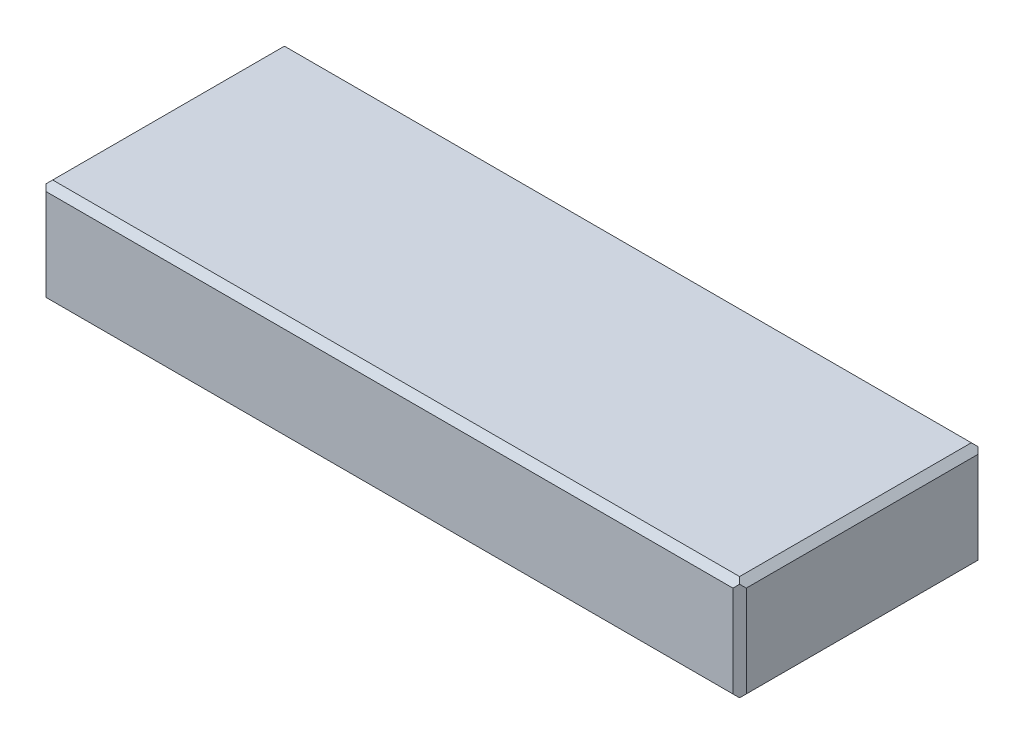
ISO-10303-21;
HEADER;
FILE_DESCRIPTION(('STEP AP214'),'2;1');
FILE_NAME('part.step','',(''),(''),'','','');
FILE_SCHEMA(('AUTOMOTIVE_DESIGN { 1 0 10303 214 1 1 1 1 }'));
ENDSEC;
DATA;
#1=APPLICATION_CONTEXT('core data for automotive mechanical design processes');
#2=APPLICATION_PROTOCOL_DEFINITION('international standard','automotive_design',2000,#1);
#3=PRODUCT_CONTEXT('',#1,'mechanical');
#4=PRODUCT('Part','Part','',(#3));
#5=PRODUCT_RELATED_PRODUCT_CATEGORY('part','',(#4));
#6=PRODUCT_DEFINITION_FORMATION('','',#4);
#7=PRODUCT_DEFINITION_CONTEXT('part definition',#1,'design');
#8=PRODUCT_DEFINITION('design','',#6,#7);
#9=PRODUCT_DEFINITION_SHAPE('','',#8);
#10=(LENGTH_UNIT() NAMED_UNIT(*) SI_UNIT(.MILLI.,.METRE.));
#11=(NAMED_UNIT(*) PLANE_ANGLE_UNIT() SI_UNIT($,.RADIAN.));
#12=(NAMED_UNIT(*) SI_UNIT($,.STERADIAN.) SOLID_ANGLE_UNIT());
#13=UNCERTAINTY_MEASURE_WITH_UNIT(LENGTH_MEASURE(1.E-05),#10,'distance_accuracy_value','');
#14=(GEOMETRIC_REPRESENTATION_CONTEXT(3) GLOBAL_UNCERTAINTY_ASSIGNED_CONTEXT((#13)) GLOBAL_UNIT_ASSIGNED_CONTEXT((#10,
#11,#12)) REPRESENTATION_CONTEXT('',''));
#15=CARTESIAN_POINT('',(0.,0.,0.));
#16=DIRECTION('',(0.,0.,1.));
#17=DIRECTION('',(1.,0.,0.));
#18=AXIS2_PLACEMENT_3D('',#15,#16,#17);
#19=CARTESIAN_POINT('',(-49.1218653149621,29.1510548523207,73.5));
#20=DIRECTION('',(1.,0.,0.));
#21=DIRECTION('',(0.,0.,-1.));
#22=AXIS2_PLACEMENT_3D('',#19,#20,#21);
#23=PLANE('',#22);
#24=DIRECTION('',(0.,0.,1.));
#25=VECTOR('',#24,1.);
#26=CARTESIAN_POINT('',(-49.1218653149621,-0.348945147679344,73.5));
#27=LINE('',#26,#25);
#28=CARTESIAN_POINT('',(-49.1218653149621,-0.348945147679344,1.99999999999996));
#29=VERTEX_POINT('',#28);
#30=CARTESIAN_POINT('',(-49.1218653149621,-0.348945147679344,71.5));
#31=VERTEX_POINT('',#30);
#32=EDGE_CURVE('E171',#29,#31,#27,.T.);
#33=ORIENTED_EDGE('',*,*,#32,.T.);
#34=DIRECTION('',(0.,1.,0.));
#35=VECTOR('',#34,1.);
#36=CARTESIAN_POINT('',(-49.1218653149621,27.1510548523207,71.5));
#37=LINE('',#36,#35);
#38=CARTESIAN_POINT('',(-49.1218653149621,27.1510548523207,71.5));
#39=VERTEX_POINT('',#38);
#40=EDGE_CURVE('E234',#31,#39,#37,.T.);
#41=ORIENTED_EDGE('',*,*,#40,.T.);
#42=DIRECTION('',(0.,0.,-1.));
#43=VECTOR('',#42,1.);
#44=CARTESIAN_POINT('',(-49.1218653149621,27.1510548523207,73.5));
#45=LINE('',#44,#43);
#46=CARTESIAN_POINT('',(-49.1218653149621,27.1510548523207,1.99999999999996));
#47=VERTEX_POINT('',#46);
#48=EDGE_CURVE('E182',#39,#47,#45,.T.);
#49=ORIENTED_EDGE('',*,*,#48,.T.);
#50=DIRECTION('',(0.,-1.,0.));
#51=VECTOR('',#50,1.);
#52=CARTESIAN_POINT('',(-49.1218653149621,29.1510548523207,1.99999999999997));
#53=LINE('',#52,#51);
#54=EDGE_CURVE('E231',#47,#29,#53,.T.);
#55=ORIENTED_EDGE('',*,*,#54,.T.);
#56=EDGE_LOOP('',(#33,#41,#49,#55));
#57=FACE_BOUND('',#56,.T.);
#58=ADVANCED_FACE('F30',(#57),#23,.F.);
#59=CARTESIAN_POINT('',(-49.1218653149621,-2.34894514767932,73.5));
#60=DIRECTION('',(0.,1.,0.));
#61=DIRECTION('',(0.,0.,1.));
#62=AXIS2_PLACEMENT_3D('',#59,#60,#61);
#63=PLANE('',#62);
#64=DIRECTION('',(-1.,0.,0.));
#65=VECTOR('',#64,1.);
#66=CARTESIAN_POINT('',(-49.1218653149621,-2.34894514767932,71.5));
#67=LINE('',#66,#65);
#68=CARTESIAN_POINT('',(158.878134685038,-2.34894514767932,71.5));
#69=VERTEX_POINT('',#68);
#70=CARTESIAN_POINT('',(-47.1218653149621,-2.34894514767932,71.5));
#71=VERTEX_POINT('',#70);
#72=EDGE_CURVE('E160',#69,#71,#67,.T.);
#73=ORIENTED_EDGE('',*,*,#72,.T.);
#74=DIRECTION('',(0.,0.,-1.));
#75=VECTOR('',#74,1.);
#76=CARTESIAN_POINT('',(-47.1218653149621,-2.34894514767932,73.5));
#77=LINE('',#76,#75);
#78=CARTESIAN_POINT('',(-47.1218653149621,-2.34894514767932,1.99999999999997));
#79=VERTEX_POINT('',#78);
#80=EDGE_CURVE('E159',#71,#79,#77,.T.);
#81=ORIENTED_EDGE('',*,*,#80,.T.);
#82=DIRECTION('',(1.,0.,0.));
#83=VECTOR('',#82,1.);
#84=CARTESIAN_POINT('',(-49.1218653149621,-2.34894514767932,1.99999999999997));
#85=LINE('',#84,#83);
#86=CARTESIAN_POINT('',(158.878134685038,-2.34894514767932,1.99999999999997));
#87=VERTEX_POINT('',#86);
#88=EDGE_CURVE('E145',#79,#87,#85,.T.);
#89=ORIENTED_EDGE('',*,*,#88,.T.);
#90=DIRECTION('',(0.,0.,1.));
#91=VECTOR('',#90,1.);
#92=CARTESIAN_POINT('',(158.878134685038,-2.34894514767932,73.5));
#93=LINE('',#92,#91);
#94=EDGE_CURVE('E156',#87,#69,#93,.T.);
#95=ORIENTED_EDGE('',*,*,#94,.T.);
#96=EDGE_LOOP('',(#73,#81,#89,#95));
#97=FACE_BOUND('',#96,.T.);
#98=ADVANCED_FACE('F155',(#97),#63,.F.);
#99=CARTESIAN_POINT('',(160.878134685038,29.1510548523207,73.5));
#100=DIRECTION('',(-1.,0.,0.));
#101=DIRECTION('',(0.,0.,1.));
#102=AXIS2_PLACEMENT_3D('',#99,#100,#101);
#103=PLANE('',#102);
#104=DIRECTION('',(0.,0.,1.));
#105=VECTOR('',#104,1.);
#106=CARTESIAN_POINT('',(160.878134685038,27.1510548523207,73.5));
#107=LINE('',#106,#105);
#108=CARTESIAN_POINT('',(160.878134685038,27.1510548523207,1.99999999999996));
#109=VERTEX_POINT('',#108);
#110=CARTESIAN_POINT('',(160.878134685038,27.1510548523207,71.5));
#111=VERTEX_POINT('',#110);
#112=EDGE_CURVE('E203',#109,#111,#107,.T.);
#113=ORIENTED_EDGE('',*,*,#112,.T.);
#114=DIRECTION('',(0.,-1.,0.));
#115=VECTOR('',#114,1.);
#116=CARTESIAN_POINT('',(160.878134685038,-0.348945147679344,71.5));
#117=LINE('',#116,#115);
#118=CARTESIAN_POINT('',(160.878134685038,-0.348945147679344,71.5));
#119=VERTEX_POINT('',#118);
#120=EDGE_CURVE('E251',#111,#119,#117,.T.);
#121=ORIENTED_EDGE('',*,*,#120,.T.);
#122=DIRECTION('',(0.,0.,-1.));
#123=VECTOR('',#122,1.);
#124=CARTESIAN_POINT('',(160.878134685038,-0.348945147679344,73.5));
#125=LINE('',#124,#123);
#126=CARTESIAN_POINT('',(160.878134685038,-0.348945147679346,1.99999999999996));
#127=VERTEX_POINT('',#126);
#128=EDGE_CURVE('E179',#119,#127,#125,.T.);
#129=ORIENTED_EDGE('',*,*,#128,.T.);
#130=DIRECTION('',(0.,1.,0.));
#131=VECTOR('',#130,1.);
#132=CARTESIAN_POINT('',(160.878134685038,29.1510548523207,1.99999999999997));
#133=LINE('',#132,#131);
#134=EDGE_CURVE('E248',#127,#109,#133,.T.);
#135=ORIENTED_EDGE('',*,*,#134,.T.);
#136=EDGE_LOOP('',(#113,#121,#129,#135));
#137=FACE_BOUND('',#136,.T.);
#138=ADVANCED_FACE('F304',(#137),#103,.F.);
#139=CARTESIAN_POINT('',(-49.1218653149621,29.1510548523207,73.5));
#140=DIRECTION('',(0.,-1.,0.));
#141=DIRECTION('',(0.,0.,-1.));
#142=AXIS2_PLACEMENT_3D('',#139,#140,#141);
#143=PLANE('',#142);
#144=DIRECTION('',(-1.,0.,0.));
#145=VECTOR('',#144,1.);
#146=CARTESIAN_POINT('',(-49.1218653149621,29.1510548523207,1.99999999999997));
#147=LINE('',#146,#145);
#148=CARTESIAN_POINT('',(158.878134685038,29.1510548523207,1.99999999999997));
#149=VERTEX_POINT('',#148);
#150=CARTESIAN_POINT('',(-47.1218653149621,29.1510548523207,1.99999999999997));
#151=VERTEX_POINT('',#150);
#152=EDGE_CURVE('E190',#149,#151,#147,.T.);
#153=ORIENTED_EDGE('',*,*,#152,.T.);
#154=DIRECTION('',(0.,0.,1.));
#155=VECTOR('',#154,1.);
#156=CARTESIAN_POINT('',(-47.1218653149621,29.1510548523207,73.5));
#157=LINE('',#156,#155);
#158=CARTESIAN_POINT('',(-47.1218653149621,29.1510548523207,71.5));
#159=VERTEX_POINT('',#158);
#160=EDGE_CURVE('E197',#151,#159,#157,.T.);
#161=ORIENTED_EDGE('',*,*,#160,.T.);
#162=DIRECTION('',(1.,0.,0.));
#163=VECTOR('',#162,1.);
#164=CARTESIAN_POINT('',(160.878134685038,29.1510548523207,71.5));
#165=LINE('',#164,#163);
#166=CARTESIAN_POINT('',(158.878134685038,29.1510548523207,71.5));
#167=VERTEX_POINT('',#166);
#168=EDGE_CURVE('E194',#159,#167,#165,.T.);
#169=ORIENTED_EDGE('',*,*,#168,.T.);
#170=DIRECTION('',(0.,0.,-1.));
#171=VECTOR('',#170,1.);
#172=CARTESIAN_POINT('',(158.878134685038,29.1510548523207,73.5));
#173=LINE('',#172,#171);
#174=EDGE_CURVE('E192',#167,#149,#173,.T.);
#175=ORIENTED_EDGE('',*,*,#174,.T.);
#176=EDGE_LOOP('',(#153,#161,#169,#175));
#177=FACE_BOUND('',#176,.T.);
#178=ADVANCED_FACE('F295',(#177),#143,.F.);
#179=CARTESIAN_POINT('',(-49.1218653149621,-2.34894514767932,73.5));
#180=DIRECTION('',(0.,0.,1.));
#181=DIRECTION('',(1.,0.,0.));
#182=AXIS2_PLACEMENT_3D('',#179,#180,#181);
#183=PLANE('',#182);
#184=DIRECTION('',(-1.,0.,0.));
#185=VECTOR('',#184,1.);
#186=CARTESIAN_POINT('',(-49.1218653149621,27.1510548523207,73.5));
#187=LINE('',#186,#185);
#188=CARTESIAN_POINT('',(158.878134685038,27.1510548523207,73.5));
#189=VERTEX_POINT('',#188);
#190=CARTESIAN_POINT('',(-47.1218653149621,27.1510548523207,73.5));
#191=VERTEX_POINT('',#190);
#192=EDGE_CURVE('E200',#189,#191,#187,.T.);
#193=ORIENTED_EDGE('',*,*,#192,.T.);
#194=DIRECTION('',(0.,-1.,0.));
#195=VECTOR('',#194,1.);
#196=CARTESIAN_POINT('',(-47.1218653149621,-0.348945147679344,73.5));
#197=LINE('',#196,#195);
#198=CARTESIAN_POINT('',(-47.1218653149621,-0.348945147679339,73.5));
#199=VERTEX_POINT('',#198);
#200=EDGE_CURVE('E220',#191,#199,#197,.T.);
#201=ORIENTED_EDGE('',*,*,#200,.T.);
#202=DIRECTION('',(1.,0.,0.));
#203=VECTOR('',#202,1.);
#204=CARTESIAN_POINT('',(160.878134685038,-0.348945147679344,73.5));
#205=LINE('',#204,#203);
#206=CARTESIAN_POINT('',(158.878134685038,-0.348945147679337,73.5));
#207=VERTEX_POINT('',#206);
#208=EDGE_CURVE('E176',#199,#207,#205,.T.);
#209=ORIENTED_EDGE('',*,*,#208,.T.);
#210=DIRECTION('',(0.,1.,0.));
#211=VECTOR('',#210,1.);
#212=CARTESIAN_POINT('',(158.878134685038,27.1510548523207,73.5));
#213=LINE('',#212,#211);
#214=EDGE_CURVE('E208',#207,#189,#213,.T.);
#215=ORIENTED_EDGE('',*,*,#214,.T.);
#216=EDGE_LOOP('',(#193,#201,#209,#215));
#217=FACE_BOUND('',#216,.T.);
#218=ADVANCED_FACE('F338',(#217),#183,.T.);
#219=CARTESIAN_POINT('',(-49.1218653149621,-2.34894514767932,0.));
#220=DIRECTION('',(0.,0.,1.));
#221=DIRECTION('',(1.,0.,0.));
#222=AXIS2_PLACEMENT_3D('',#219,#220,#221);
#223=PLANE('',#222);
#224=DIRECTION('',(1.,0.,0.));
#225=VECTOR('',#224,1.);
#226=CARTESIAN_POINT('',(-49.1218653149621,27.1510548523207,0.));
#227=LINE('',#226,#225);
#228=CARTESIAN_POINT('',(-47.1218653149621,27.1510548523207,0.));
#229=VERTEX_POINT('',#228);
#230=CARTESIAN_POINT('',(158.878134685038,27.1510548523207,0.));
#231=VERTEX_POINT('',#230);
#232=EDGE_CURVE('E206',#229,#231,#227,.T.);
#233=ORIENTED_EDGE('',*,*,#232,.T.);
#234=DIRECTION('',(0.,-1.,0.));
#235=VECTOR('',#234,1.);
#236=CARTESIAN_POINT('',(158.878134685038,-2.34894514767932,0.));
#237=LINE('',#236,#235);
#238=CARTESIAN_POINT('',(158.878134685038,-0.348945147679344,0.));
#239=VERTEX_POINT('',#238);
#240=EDGE_CURVE('E51',#231,#239,#237,.T.);
#241=ORIENTED_EDGE('',*,*,#240,.T.);
#242=DIRECTION('',(-1.,0.,0.));
#243=VECTOR('',#242,1.);
#244=CARTESIAN_POINT('',(-49.1218653149621,-0.348945147679344,0.));
#245=LINE('',#244,#243);
#246=CARTESIAN_POINT('',(-47.1218653149621,-0.348945147679344,0.));
#247=VERTEX_POINT('',#246);
#248=EDGE_CURVE('E174',#239,#247,#245,.T.);
#249=ORIENTED_EDGE('',*,*,#248,.T.);
#250=DIRECTION('',(0.,1.,0.));
#251=VECTOR('',#250,1.);
#252=CARTESIAN_POINT('',(-47.1218653149621,-2.34894514767932,0.));
#253=LINE('',#252,#251);
#254=EDGE_CURVE('E261',#247,#229,#253,.T.);
#255=ORIENTED_EDGE('',*,*,#254,.T.);
#256=EDGE_LOOP('',(#233,#241,#249,#255));
#257=FACE_BOUND('',#256,.T.);
#258=ADVANCED_FACE('F265',(#257),#223,.F.);
#259=CARTESIAN_POINT('',(160.878134685038,-0.348945147679344,73.5));
#260=DIRECTION('',(-0.707106781186547,0.707106781186547,0.));
#261=DIRECTION('',(-0.707106781186548,-0.707106781186548,0.));
#262=AXIS2_PLACEMENT_3D('',#259,#260,#261);
#263=PLANE('',#262);
#264=ORIENTED_EDGE('',*,*,#128,.F.);
#265=DIRECTION('',(0.577350269189626,0.577350269189626,-0.577350269189626));
#266=VECTOR('',#265,1.);
#267=CARTESIAN_POINT('',(160.211468018371,-1.01561181434602,72.1666666666666));
#268=LINE('',#267,#266);
#269=CARTESIAN_POINT('',(159.878134685038,-1.34894514767936,72.5));
#270=VERTEX_POINT('',#269);
#271=EDGE_CURVE('E255',#119,#270,#268,.F.);
#272=ORIENTED_EDGE('',*,*,#271,.T.);
#273=DIRECTION('',(0.577350269189626,0.577350269189626,0.577350269189626));
#274=VECTOR('',#273,1.);
#275=CARTESIAN_POINT('',(160.878134685038,-0.348945147679344,73.5));
#276=LINE('',#275,#274);
#277=EDGE_CURVE('E151',#69,#270,#276,.T.);
#278=ORIENTED_EDGE('',*,*,#277,.F.);
#279=ORIENTED_EDGE('',*,*,#94,.F.);
#280=DIRECTION('',(0.577350269189626,0.577350269189626,-0.577350269189626));
#281=VECTOR('',#280,1.);
#282=CARTESIAN_POINT('',(136.378134685038,-24.8489451476793,24.5));
#283=LINE('',#282,#281);
#284=CARTESIAN_POINT('',(159.878134685038,-1.34894514767933,0.999999999999985));
#285=VERTEX_POINT('',#284);
#286=EDGE_CURVE('E142',#285,#87,#283,.F.);
#287=ORIENTED_EDGE('',*,*,#286,.F.);
#288=DIRECTION('',(0.577350269189626,0.577350269189626,0.577350269189626));
#289=VECTOR('',#288,1.);
#290=CARTESIAN_POINT('',(184.711468018371,23.484388185654,25.8333333333333));
#291=LINE('',#290,#289);
#292=EDGE_CURVE('E253',#285,#127,#291,.T.);
#293=ORIENTED_EDGE('',*,*,#292,.T.);
#294=EDGE_LOOP('',(#264,#272,#278,#279,#287,#293));
#295=FACE_BOUND('',#294,.T.);
#296=ADVANCED_FACE('F163',(#295),#263,.F.);
#297=CARTESIAN_POINT('',(-49.1218653149621,-0.348945147679344,73.5));
#298=DIRECTION('',(0.,-0.707106781186547,0.707106781186547));
#299=DIRECTION('',(0.,-0.707106781186548,-0.707106781186548));
#300=AXIS2_PLACEMENT_3D('',#297,#298,#299);
#301=PLANE('',#300);
#302=ORIENTED_EDGE('',*,*,#208,.F.);
#303=DIRECTION('',(-0.577350269189626,-0.577350269189626,-0.577350269189626));
#304=VECTOR('',#303,1.);
#305=CARTESIAN_POINT('',(-47.7885319816288,-1.015611814346,72.8333333333333));
#306=LINE('',#305,#304);
#307=CARTESIAN_POINT('',(-48.1218653149621,-1.34894514767933,72.5));
#308=VERTEX_POINT('',#307);
#309=EDGE_CURVE('E225',#199,#308,#306,.T.);
#310=ORIENTED_EDGE('',*,*,#309,.T.);
#311=DIRECTION('',(-0.577350269189626,0.577350269189626,0.577350269189626));
#312=VECTOR('',#311,1.);
#313=CARTESIAN_POINT('',(-49.1218653149621,-0.348945147679344,73.5));
#314=LINE('',#313,#312);
#315=EDGE_CURVE('E152',#71,#308,#314,.T.);
#316=ORIENTED_EDGE('',*,*,#315,.F.);
#317=ORIENTED_EDGE('',*,*,#72,.F.);
#318=ORIENTED_EDGE('',*,*,#277,.T.);
#319=DIRECTION('',(-0.577350269189626,0.577350269189626,0.577350269189626));
#320=VECTOR('',#319,1.);
#321=CARTESIAN_POINT('',(89.5448013517045,68.984388185654,142.833333333333));
#322=LINE('',#321,#320);
#323=EDGE_CURVE('E223',#270,#207,#322,.T.);
#324=ORIENTED_EDGE('',*,*,#323,.T.);
#325=EDGE_LOOP('',(#302,#310,#316,#317,#318,#324));
#326=FACE_BOUND('',#325,.T.);
#327=ADVANCED_FACE('F314',(#326),#301,.T.);
#328=CARTESIAN_POINT('',(-49.1218653149621,-2.34894514767932,1.99999999999997));
#329=DIRECTION('',(0.,0.707106781186547,0.707106781186547));
#330=DIRECTION('',(0.,-0.707106781186548,0.707106781186548));
#331=AXIS2_PLACEMENT_3D('',#328,#329,#330);
#332=PLANE('',#331);
#333=ORIENTED_EDGE('',*,*,#248,.F.);
#334=DIRECTION('',(0.577350269189626,-0.577350269189626,0.577350269189626));
#335=VECTOR('',#334,1.);
#336=CARTESIAN_POINT('',(90.8781346850379,67.6510548523207,-68.));
#337=LINE('',#336,#335);
#338=EDGE_CURVE('E11',#239,#285,#337,.T.);
#339=ORIENTED_EDGE('',*,*,#338,.T.);
#340=ORIENTED_EDGE('',*,*,#286,.T.);
#341=ORIENTED_EDGE('',*,*,#88,.F.);
#342=DIRECTION('',(-0.577350269189626,0.577350269189626,-0.577350269189626));
#343=VECTOR('',#342,1.);
#344=CARTESIAN_POINT('',(-47.7885319816288,-1.68227848101266,1.33333333333332));
#345=LINE('',#344,#343);
#346=CARTESIAN_POINT('',(-48.1218653149621,-1.34894514767933,0.999999999999986));
#347=VERTEX_POINT('',#346);
#348=EDGE_CURVE('E183',#347,#79,#345,.F.);
#349=ORIENTED_EDGE('',*,*,#348,.F.);
#350=DIRECTION('',(0.577350269189626,0.577350269189626,-0.577350269189626));
#351=VECTOR('',#350,1.);
#352=CARTESIAN_POINT('',(-49.1218653149621,-2.34894514767932,1.99999999999997));
#353=LINE('',#352,#351);
#354=EDGE_CURVE('E38',#347,#247,#353,.T.);
#355=ORIENTED_EDGE('',*,*,#354,.T.);
#356=EDGE_LOOP('',(#333,#339,#340,#341,#349,#355));
#357=FACE_BOUND('',#356,.T.);
#358=ADVANCED_FACE('F144',(#357),#332,.F.);
#359=CARTESIAN_POINT('',(-47.1218653149621,-2.34894514767932,73.5));
#360=DIRECTION('',(0.707106781186547,0.707106781186547,0.));
#361=DIRECTION('',(-0.707106781186548,0.707106781186548,0.));
#362=AXIS2_PLACEMENT_3D('',#359,#360,#361);
#363=PLANE('',#362);
#364=ORIENTED_EDGE('',*,*,#315,.T.);
#365=DIRECTION('',(0.577350269189626,-0.577350269189626,0.577350269189626));
#366=VECTOR('',#365,1.);
#367=CARTESIAN_POINT('',(-47.1218653149621,-2.34894514767932,73.5));
#368=LINE('',#367,#366);
#369=EDGE_CURVE('E229',#308,#31,#368,.F.);
#370=ORIENTED_EDGE('',*,*,#369,.T.);
#371=ORIENTED_EDGE('',*,*,#32,.F.);
#372=DIRECTION('',(0.577350269189626,-0.577350269189626,-0.577350269189626));
#373=VECTOR('',#372,1.);
#374=CARTESIAN_POINT('',(-71.6218653149621,22.1510548523207,24.5));
#375=LINE('',#374,#373);
#376=EDGE_CURVE('E227',#29,#347,#375,.T.);
#377=ORIENTED_EDGE('',*,*,#376,.T.);
#378=ORIENTED_EDGE('',*,*,#348,.T.);
#379=ORIENTED_EDGE('',*,*,#80,.F.);
#380=EDGE_LOOP('',(#364,#370,#371,#377,#378,#379));
#381=FACE_BOUND('',#380,.T.);
#382=ADVANCED_FACE('F317',(#381),#363,.F.);
#383=CARTESIAN_POINT('',(158.878134685038,29.1510548523207,73.5));
#384=DIRECTION('',(-0.707106781186547,-0.707106781186547,0.));
#385=DIRECTION('',(0.707106781186548,-0.707106781186548,0.));
#386=AXIS2_PLACEMENT_3D('',#383,#384,#385);
#387=PLANE('',#386);
#388=DIRECTION('',(-0.577350269189626,0.577350269189626,-0.577350269189626));
#389=VECTOR('',#388,1.);
#390=CARTESIAN_POINT('',(159.544801351705,28.484388185654,72.1666666666667));
#391=LINE('',#390,#389);
#392=CARTESIAN_POINT('',(159.878134685038,28.1510548523207,72.5));
#393=VERTEX_POINT('',#392);
#394=EDGE_CURVE('E185',#393,#167,#391,.T.);
#395=ORIENTED_EDGE('',*,*,#394,.F.);
#396=DIRECTION('',(-0.577350269189626,0.577350269189626,0.577350269189626));
#397=VECTOR('',#396,1.);
#398=CARTESIAN_POINT('',(158.878134685038,29.1510548523207,73.5));
#399=LINE('',#398,#397);
#400=EDGE_CURVE('E246',#393,#111,#399,.F.);
#401=ORIENTED_EDGE('',*,*,#400,.T.);
#402=ORIENTED_EDGE('',*,*,#112,.F.);
#403=DIRECTION('',(-0.577350269189626,0.577350269189626,-0.577350269189626));
#404=VECTOR('',#403,1.);
#405=CARTESIAN_POINT('',(183.378134685038,4.65105485232068,24.5));
#406=LINE('',#405,#404);
#407=CARTESIAN_POINT('',(159.878134685038,28.1510548523207,0.999999999999987));
#408=VERTEX_POINT('',#407);
#409=EDGE_CURVE('E244',#109,#408,#406,.T.);
#410=ORIENTED_EDGE('',*,*,#409,.T.);
#411=DIRECTION('',(0.577350269189626,-0.577350269189626,-0.577350269189626));
#412=VECTOR('',#411,1.);
#413=CARTESIAN_POINT('',(89.5448013517046,98.484388185654,71.3333333333333));
#414=LINE('',#413,#412);
#415=EDGE_CURVE('E214',#149,#408,#414,.T.);
#416=ORIENTED_EDGE('',*,*,#415,.F.);
#417=ORIENTED_EDGE('',*,*,#174,.F.);
#418=EDGE_LOOP('',(#395,#401,#402,#410,#416,#417));
#419=FACE_BOUND('',#418,.T.);
#420=ADVANCED_FACE('F319',(#419),#387,.F.);
#421=CARTESIAN_POINT('',(-49.1218653149621,27.1510548523207,73.5));
#422=DIRECTION('',(0.,0.707106781186547,0.707106781186547));
#423=DIRECTION('',(0.,-0.707106781186548,0.707106781186548));
#424=AXIS2_PLACEMENT_3D('',#421,#422,#423);
#425=PLANE('',#424);
#426=DIRECTION('',(0.577350269189626,0.577350269189626,-0.577350269189626));
#427=VECTOR('',#426,1.);
#428=CARTESIAN_POINT('',(-49.1218653149621,27.1510548523207,73.5));
#429=LINE('',#428,#427);
#430=CARTESIAN_POINT('',(-48.1218653149621,28.1510548523207,72.5));
#431=VERTEX_POINT('',#430);
#432=EDGE_CURVE('E212',#431,#159,#429,.T.);
#433=ORIENTED_EDGE('',*,*,#432,.F.);
#434=DIRECTION('',(0.577350269189626,-0.577350269189626,0.577350269189626));
#435=VECTOR('',#434,1.);
#436=CARTESIAN_POINT('',(-47.7885319816288,27.8177215189874,72.8333333333333));
#437=LINE('',#436,#435);
#438=EDGE_CURVE('E242',#431,#191,#437,.T.);
#439=ORIENTED_EDGE('',*,*,#438,.T.);
#440=ORIENTED_EDGE('',*,*,#192,.F.);
#441=DIRECTION('',(0.577350269189626,0.577350269189626,-0.577350269189626));
#442=VECTOR('',#441,1.);
#443=CARTESIAN_POINT('',(89.5448013517045,-42.1822784810126,142.833333333333));
#444=LINE('',#443,#442);
#445=EDGE_CURVE('E240',#189,#393,#444,.T.);
#446=ORIENTED_EDGE('',*,*,#445,.T.);
#447=ORIENTED_EDGE('',*,*,#394,.T.);
#448=ORIENTED_EDGE('',*,*,#168,.F.);
#449=EDGE_LOOP('',(#433,#439,#440,#446,#447,#448));
#450=FACE_BOUND('',#449,.T.);
#451=ADVANCED_FACE('F290',(#450),#425,.T.);
#452=CARTESIAN_POINT('',(-49.1218653149621,29.1510548523207,1.99999999999997));
#453=DIRECTION('',(0.,-0.707106781186547,0.707106781186547));
#454=DIRECTION('',(0.,-0.707106781186548,-0.707106781186548));
#455=AXIS2_PLACEMENT_3D('',#452,#453,#454);
#456=PLANE('',#455);
#457=ORIENTED_EDGE('',*,*,#415,.T.);
#458=DIRECTION('',(-0.577350269189626,-0.577350269189626,-0.577350269189626));
#459=VECTOR('',#458,1.);
#460=CARTESIAN_POINT('',(90.8781346850379,-40.8489451476793,-68.));
#461=LINE('',#460,#459);
#462=EDGE_CURVE('E259',#408,#231,#461,.T.);
#463=ORIENTED_EDGE('',*,*,#462,.T.);
#464=ORIENTED_EDGE('',*,*,#232,.F.);
#465=DIRECTION('',(-0.577350269189626,0.577350269189626,0.577350269189626));
#466=VECTOR('',#465,1.);
#467=CARTESIAN_POINT('',(-49.1218653149621,29.1510548523207,1.99999999999997));
#468=LINE('',#467,#466);
#469=CARTESIAN_POINT('',(-48.1218653149621,28.1510548523207,0.999999999999986));
#470=VERTEX_POINT('',#469);
#471=EDGE_CURVE('E257',#229,#470,#468,.T.);
#472=ORIENTED_EDGE('',*,*,#471,.T.);
#473=DIRECTION('',(0.577350269189626,0.577350269189626,0.577350269189626));
#474=VECTOR('',#473,1.);
#475=CARTESIAN_POINT('',(-47.7885319816288,28.484388185654,1.33333333333332));
#476=LINE('',#475,#474);
#477=EDGE_CURVE('E209',#151,#470,#476,.F.);
#478=ORIENTED_EDGE('',*,*,#477,.F.);
#479=ORIENTED_EDGE('',*,*,#152,.F.);
#480=EDGE_LOOP('',(#457,#463,#464,#472,#478,#479));
#481=FACE_BOUND('',#480,.T.);
#482=ADVANCED_FACE('F269',(#481),#456,.F.);
#483=CARTESIAN_POINT('',(-49.1218653149621,27.1510548523207,73.5));
#484=DIRECTION('',(0.707106781186547,-0.707106781186547,0.));
#485=DIRECTION('',(0.707106781186548,0.707106781186548,0.));
#486=AXIS2_PLACEMENT_3D('',#483,#484,#485);
#487=PLANE('',#486);
#488=ORIENTED_EDGE('',*,*,#48,.F.);
#489=DIRECTION('',(-0.577350269189626,-0.577350269189626,-0.577350269189626));
#490=VECTOR('',#489,1.);
#491=CARTESIAN_POINT('',(-48.4551986482954,27.8177215189874,72.1666666666667));
#492=LINE('',#491,#490);
#493=EDGE_CURVE('E238',#39,#431,#492,.F.);
#494=ORIENTED_EDGE('',*,*,#493,.T.);
#495=ORIENTED_EDGE('',*,*,#432,.T.);
#496=ORIENTED_EDGE('',*,*,#160,.F.);
#497=ORIENTED_EDGE('',*,*,#477,.T.);
#498=DIRECTION('',(-0.577350269189626,-0.577350269189626,0.577350269189626));
#499=VECTOR('',#498,1.);
#500=CARTESIAN_POINT('',(-72.9551986482955,3.31772151898737,25.8333333333333));
#501=LINE('',#500,#499);
#502=EDGE_CURVE('E236',#470,#47,#501,.T.);
#503=ORIENTED_EDGE('',*,*,#502,.T.);
#504=EDGE_LOOP('',(#488,#494,#495,#496,#497,#503));
#505=FACE_BOUND('',#504,.T.);
#506=ADVANCED_FACE('F276',(#505),#487,.F.);
#507=CARTESIAN_POINT('',(-47.1218653149621,-2.34894514767932,73.5));
#508=DIRECTION('',(-0.707106781186547,0.,0.707106781186547));
#509=DIRECTION('',(0.707106781186548,0.,0.707106781186548));
#510=AXIS2_PLACEMENT_3D('',#507,#508,#509);
#511=PLANE('',#510);
#512=ORIENTED_EDGE('',*,*,#493,.F.);
#513=ORIENTED_EDGE('',*,*,#40,.F.);
#514=ORIENTED_EDGE('',*,*,#369,.F.);
#515=ORIENTED_EDGE('',*,*,#309,.F.);
#516=ORIENTED_EDGE('',*,*,#200,.F.);
#517=ORIENTED_EDGE('',*,*,#438,.F.);
#518=EDGE_LOOP('',(#512,#513,#514,#515,#516,#517));
#519=FACE_BOUND('',#518,.T.);
#520=ADVANCED_FACE('F284',(#519),#511,.T.);
#521=CARTESIAN_POINT('',(158.878134685038,-2.34894514767932,73.5));
#522=DIRECTION('',(0.707106781186547,0.,0.707106781186547));
#523=DIRECTION('',(0.707106781186548,0.,-0.707106781186548));
#524=AXIS2_PLACEMENT_3D('',#521,#522,#523);
#525=PLANE('',#524);
#526=ORIENTED_EDGE('',*,*,#271,.F.);
#527=ORIENTED_EDGE('',*,*,#120,.F.);
#528=ORIENTED_EDGE('',*,*,#400,.F.);
#529=ORIENTED_EDGE('',*,*,#445,.F.);
#530=ORIENTED_EDGE('',*,*,#214,.F.);
#531=ORIENTED_EDGE('',*,*,#323,.F.);
#532=EDGE_LOOP('',(#526,#527,#528,#529,#530,#531));
#533=FACE_BOUND('',#532,.T.);
#534=ADVANCED_FACE('F309',(#533),#525,.T.);
#535=CARTESIAN_POINT('',(160.878134685038,29.1510548523207,1.99999999999997));
#536=DIRECTION('',(-0.707106781186547,0.,0.707106781186547));
#537=DIRECTION('',(0.707106781186548,0.,0.707106781186548));
#538=AXIS2_PLACEMENT_3D('',#535,#536,#537);
#539=PLANE('',#538);
#540=ORIENTED_EDGE('',*,*,#338,.F.);
#541=ORIENTED_EDGE('',*,*,#240,.F.);
#542=ORIENTED_EDGE('',*,*,#462,.F.);
#543=ORIENTED_EDGE('',*,*,#409,.F.);
#544=ORIENTED_EDGE('',*,*,#134,.F.);
#545=ORIENTED_EDGE('',*,*,#292,.F.);
#546=EDGE_LOOP('',(#540,#541,#542,#543,#544,#545));
#547=FACE_BOUND('',#546,.T.);
#548=ADVANCED_FACE('F300',(#547),#539,.F.);
#549=CARTESIAN_POINT('',(-49.1218653149621,29.1510548523207,1.99999999999997));
#550=DIRECTION('',(0.707106781186547,0.,0.707106781186547));
#551=DIRECTION('',(0.707106781186548,0.,-0.707106781186548));
#552=AXIS2_PLACEMENT_3D('',#549,#550,#551);
#553=PLANE('',#552);
#554=ORIENTED_EDGE('',*,*,#471,.F.);
#555=ORIENTED_EDGE('',*,*,#254,.F.);
#556=ORIENTED_EDGE('',*,*,#354,.F.);
#557=ORIENTED_EDGE('',*,*,#376,.F.);
#558=ORIENTED_EDGE('',*,*,#54,.F.);
#559=ORIENTED_EDGE('',*,*,#502,.F.);
#560=EDGE_LOOP('',(#554,#555,#556,#557,#558,#559));
#561=FACE_BOUND('',#560,.T.);
#562=ADVANCED_FACE('F32',(#561),#553,.F.);
#563=CLOSED_SHELL('',(#58,#98,#138,#178,#218,#258,#296,#327,#358,#382,#420,#451,#482,#506,#520,
#534,#548,#562));
#564=MANIFOLD_SOLID_BREP('B2',#563);
#565=ADVANCED_BREP_SHAPE_REPRESENTATION('',(#18,#564),#14);
#566=SHAPE_DEFINITION_REPRESENTATION(#9,#565);
ENDSEC;
END-ISO-10303-21;
